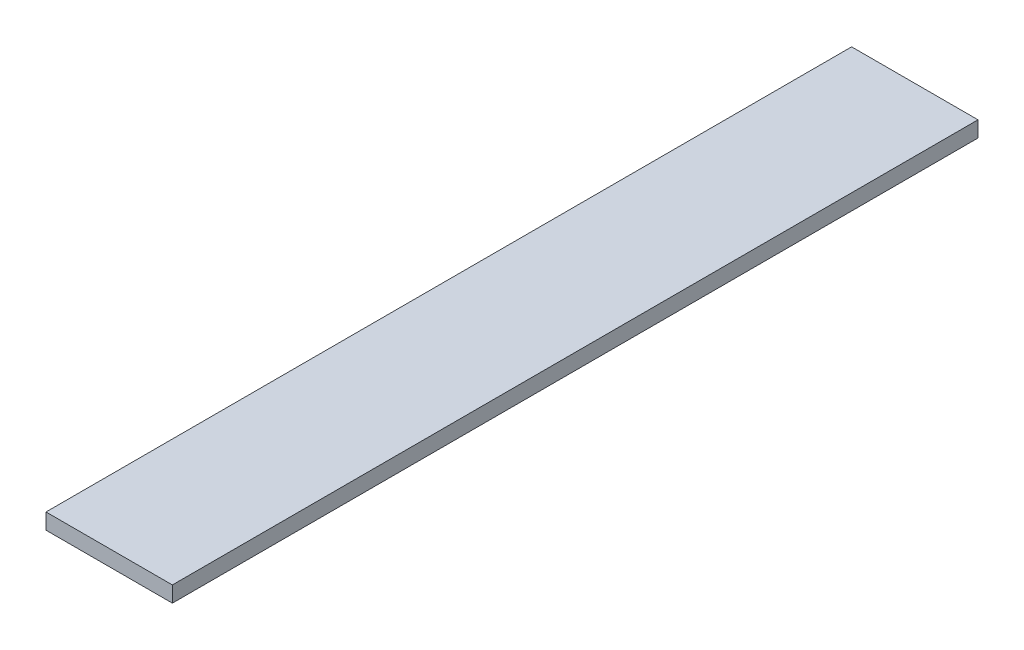
ISO-10303-21;
HEADER;
FILE_DESCRIPTION(('STEP AP214'),'2;1');
FILE_NAME('part.step','',(''),(''),'','','');
FILE_SCHEMA(('AUTOMOTIVE_DESIGN { 1 0 10303 214 1 1 1 1 }'));
ENDSEC;
DATA;
#1=APPLICATION_CONTEXT('core data for automotive mechanical design processes');
#2=APPLICATION_PROTOCOL_DEFINITION('international standard','automotive_design',2000,#1);
#3=PRODUCT_CONTEXT('',#1,'mechanical');
#4=PRODUCT('Part','Part','',(#3));
#5=PRODUCT_RELATED_PRODUCT_CATEGORY('part','',(#4));
#6=PRODUCT_DEFINITION_FORMATION('','',#4);
#7=PRODUCT_DEFINITION_CONTEXT('part definition',#1,'design');
#8=PRODUCT_DEFINITION('design','',#6,#7);
#9=PRODUCT_DEFINITION_SHAPE('','',#8);
#10=(LENGTH_UNIT() NAMED_UNIT(*) SI_UNIT(.MILLI.,.METRE.));
#11=(NAMED_UNIT(*) PLANE_ANGLE_UNIT() SI_UNIT($,.RADIAN.));
#12=(NAMED_UNIT(*) SI_UNIT($,.STERADIAN.) SOLID_ANGLE_UNIT());
#13=UNCERTAINTY_MEASURE_WITH_UNIT(LENGTH_MEASURE(1.E-05),#10,'distance_accuracy_value','');
#14=(GEOMETRIC_REPRESENTATION_CONTEXT(3) GLOBAL_UNCERTAINTY_ASSIGNED_CONTEXT((#13)) GLOBAL_UNIT_ASSIGNED_CONTEXT((#10,
#11,#12)) REPRESENTATION_CONTEXT('',''));
#15=CARTESIAN_POINT('',(0.,0.,0.));
#16=DIRECTION('',(0.,0.,1.));
#17=DIRECTION('',(1.,0.,0.));
#18=AXIS2_PLACEMENT_3D('',#15,#16,#17);
#19=CARTESIAN_POINT('',(50.8,12.7,-323.85));
#20=DIRECTION('',(-1.,0.,0.));
#21=DIRECTION('',(0.,0.,1.));
#22=AXIS2_PLACEMENT_3D('',#19,#20,#21);
#23=PLANE('',#22);
#24=DIRECTION('',(0.,0.,-1.));
#25=VECTOR('',#24,1.);
#26=CARTESIAN_POINT('',(50.8,0.,-323.85));
#27=LINE('',#26,#25);
#28=CARTESIAN_POINT('',(50.8,0.,323.85));
#29=VERTEX_POINT('',#28);
#30=CARTESIAN_POINT('',(50.8,0.,-323.85));
#31=VERTEX_POINT('',#30);
#32=EDGE_CURVE('E107',#29,#31,#27,.T.);
#33=ORIENTED_EDGE('',*,*,#32,.T.);
#34=DIRECTION('',(0.,-1.,0.));
#35=VECTOR('',#34,1.);
#36=CARTESIAN_POINT('',(50.8,12.7,-323.85));
#37=LINE('',#36,#35);
#38=CARTESIAN_POINT('',(50.8,12.7,-323.85));
#39=VERTEX_POINT('',#38);
#40=EDGE_CURVE('E11',#39,#31,#37,.T.);
#41=ORIENTED_EDGE('',*,*,#40,.F.);
#42=DIRECTION('',(0.,0.,-1.));
#43=VECTOR('',#42,1.);
#44=CARTESIAN_POINT('',(50.8,12.7,-323.85));
#45=LINE('',#44,#43);
#46=CARTESIAN_POINT('',(50.8,12.7,323.85));
#47=VERTEX_POINT('',#46);
#48=EDGE_CURVE('E91',#47,#39,#45,.T.);
#49=ORIENTED_EDGE('',*,*,#48,.F.);
#50=DIRECTION('',(0.,-1.,0.));
#51=VECTOR('',#50,1.);
#52=CARTESIAN_POINT('',(50.8,12.7,323.85));
#53=LINE('',#52,#51);
#54=EDGE_CURVE('E103',#47,#29,#53,.T.);
#55=ORIENTED_EDGE('',*,*,#54,.T.);
#56=EDGE_LOOP('',(#33,#41,#49,#55));
#57=FACE_BOUND('',#56,.T.);
#58=ADVANCED_FACE('F39',(#57),#23,.F.);
#59=CARTESIAN_POINT('',(-50.8,12.7,-323.85));
#60=DIRECTION('',(0.,0.,1.));
#61=DIRECTION('',(1.,0.,0.));
#62=AXIS2_PLACEMENT_3D('',#59,#60,#61);
#63=PLANE('',#62);
#64=DIRECTION('',(-1.,0.,0.));
#65=VECTOR('',#64,1.);
#66=CARTESIAN_POINT('',(-50.8,0.,-323.85));
#67=LINE('',#66,#65);
#68=CARTESIAN_POINT('',(-50.8,0.,-323.85));
#69=VERTEX_POINT('',#68);
#70=EDGE_CURVE('E96',#31,#69,#67,.T.);
#71=ORIENTED_EDGE('',*,*,#70,.T.);
#72=DIRECTION('',(0.,-1.,0.));
#73=VECTOR('',#72,1.);
#74=CARTESIAN_POINT('',(-50.8,12.7,-323.85));
#75=LINE('',#74,#73);
#76=CARTESIAN_POINT('',(-50.8,12.7,-323.85));
#77=VERTEX_POINT('',#76);
#78=EDGE_CURVE('E48',#77,#69,#75,.T.);
#79=ORIENTED_EDGE('',*,*,#78,.F.);
#80=DIRECTION('',(-1.,0.,0.));
#81=VECTOR('',#80,1.);
#82=CARTESIAN_POINT('',(-50.8,12.7,-323.85));
#83=LINE('',#82,#81);
#84=EDGE_CURVE('E86',#39,#77,#83,.T.);
#85=ORIENTED_EDGE('',*,*,#84,.F.);
#86=ORIENTED_EDGE('',*,*,#40,.T.);
#87=EDGE_LOOP('',(#71,#79,#85,#86));
#88=FACE_BOUND('',#87,.T.);
#89=ADVANCED_FACE('F95',(#88),#63,.F.);
#90=CARTESIAN_POINT('',(-50.8,12.7,-323.85));
#91=DIRECTION('',(1.,0.,0.));
#92=DIRECTION('',(0.,0.,-1.));
#93=AXIS2_PLACEMENT_3D('',#90,#91,#92);
#94=PLANE('',#93);
#95=DIRECTION('',(0.,0.,1.));
#96=VECTOR('',#95,1.);
#97=CARTESIAN_POINT('',(-50.8,0.,-323.85));
#98=LINE('',#97,#96);
#99=CARTESIAN_POINT('',(-50.8,0.,323.85));
#100=VERTEX_POINT('',#99);
#101=EDGE_CURVE('E73',#69,#100,#98,.T.);
#102=ORIENTED_EDGE('',*,*,#101,.T.);
#103=DIRECTION('',(0.,-1.,0.));
#104=VECTOR('',#103,1.);
#105=CARTESIAN_POINT('',(-50.8,12.7,323.85));
#106=LINE('',#105,#104);
#107=CARTESIAN_POINT('',(-50.8,12.7,323.85));
#108=VERTEX_POINT('',#107);
#109=EDGE_CURVE('E98',#108,#100,#106,.T.);
#110=ORIENTED_EDGE('',*,*,#109,.F.);
#111=DIRECTION('',(0.,0.,1.));
#112=VECTOR('',#111,1.);
#113=CARTESIAN_POINT('',(-50.8,12.7,-323.85));
#114=LINE('',#113,#112);
#115=EDGE_CURVE('E89',#77,#108,#114,.T.);
#116=ORIENTED_EDGE('',*,*,#115,.F.);
#117=ORIENTED_EDGE('',*,*,#78,.T.);
#118=EDGE_LOOP('',(#102,#110,#116,#117));
#119=FACE_BOUND('',#118,.T.);
#120=ADVANCED_FACE('F99',(#119),#94,.F.);
#121=CARTESIAN_POINT('',(-50.8,12.7,323.85));
#122=DIRECTION('',(0.,0.,-1.));
#123=DIRECTION('',(-1.,0.,0.));
#124=AXIS2_PLACEMENT_3D('',#121,#122,#123);
#125=PLANE('',#124);
#126=DIRECTION('',(1.,0.,0.));
#127=VECTOR('',#126,1.);
#128=CARTESIAN_POINT('',(-50.8,0.,323.85));
#129=LINE('',#128,#127);
#130=EDGE_CURVE('E79',#100,#29,#129,.T.);
#131=ORIENTED_EDGE('',*,*,#130,.T.);
#132=ORIENTED_EDGE('',*,*,#54,.F.);
#133=DIRECTION('',(1.,0.,0.));
#134=VECTOR('',#133,1.);
#135=CARTESIAN_POINT('',(-50.8,12.7,323.85));
#136=LINE('',#135,#134);
#137=EDGE_CURVE('E56',#108,#47,#136,.T.);
#138=ORIENTED_EDGE('',*,*,#137,.F.);
#139=ORIENTED_EDGE('',*,*,#109,.T.);
#140=EDGE_LOOP('',(#131,#132,#138,#139));
#141=FACE_BOUND('',#140,.T.);
#142=ADVANCED_FACE('F120',(#141),#125,.F.);
#143=CARTESIAN_POINT('',(0.,12.7,0.));
#144=DIRECTION('',(0.,1.,0.));
#145=DIRECTION('',(0.,0.,1.));
#146=AXIS2_PLACEMENT_3D('',#143,#144,#145);
#147=PLANE('',#146);
#148=ORIENTED_EDGE('',*,*,#48,.T.);
#149=ORIENTED_EDGE('',*,*,#84,.T.);
#150=ORIENTED_EDGE('',*,*,#115,.T.);
#151=ORIENTED_EDGE('',*,*,#137,.T.);
#152=EDGE_LOOP('',(#148,#149,#150,#151));
#153=FACE_BOUND('',#152,.T.);
#154=ADVANCED_FACE('F87',(#153),#147,.T.);
#155=CARTESIAN_POINT('',(0.,0.,0.));
#156=DIRECTION('',(0.,1.,0.));
#157=DIRECTION('',(0.,0.,1.));
#158=AXIS2_PLACEMENT_3D('',#155,#156,#157);
#159=PLANE('',#158);
#160=ORIENTED_EDGE('',*,*,#32,.F.);
#161=ORIENTED_EDGE('',*,*,#130,.F.);
#162=ORIENTED_EDGE('',*,*,#101,.F.);
#163=ORIENTED_EDGE('',*,*,#70,.F.);
#164=EDGE_LOOP('',(#160,#161,#162,#163));
#165=FACE_BOUND('',#164,.T.);
#166=ADVANCED_FACE('F123',(#165),#159,.F.);
#167=CLOSED_SHELL('',(#58,#89,#120,#142,#154,#166));
#168=MANIFOLD_SOLID_BREP('B2',#167);
#169=ADVANCED_BREP_SHAPE_REPRESENTATION('',(#18,#168),#14);
#170=SHAPE_DEFINITION_REPRESENTATION(#9,#169);
ENDSEC;
END-ISO-10303-21;
